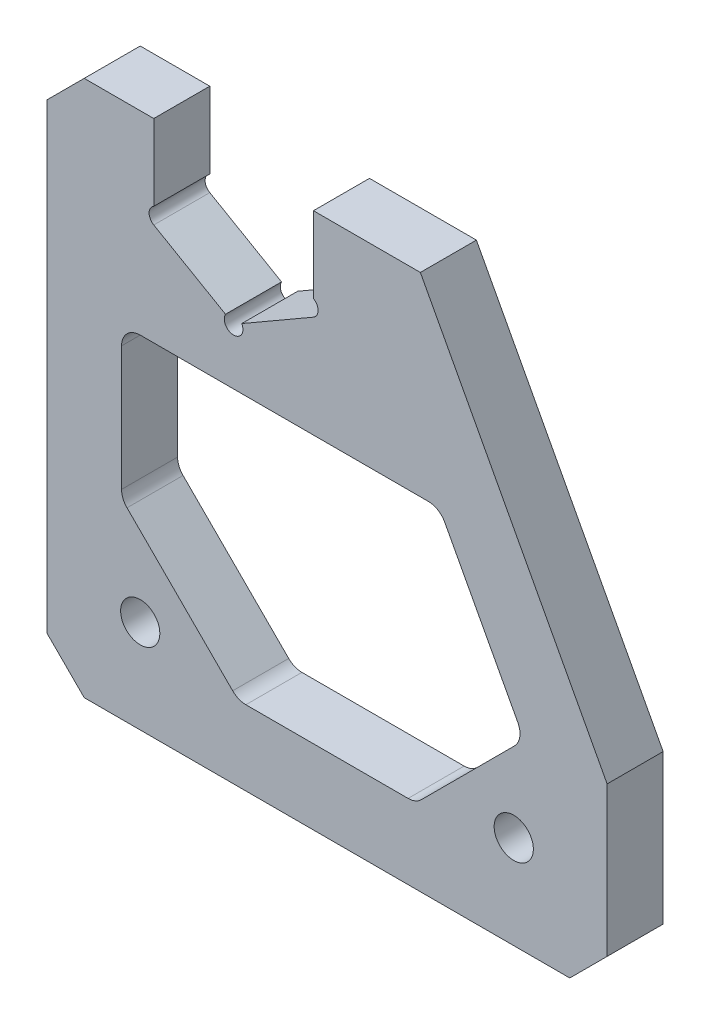
ISO-10303-21;
HEADER;
FILE_DESCRIPTION(('STEP AP214'),'2;1');
FILE_NAME('part.step','',(''),(''),'','','');
FILE_SCHEMA(('AUTOMOTIVE_DESIGN { 1 0 10303 214 1 1 1 1 }'));
ENDSEC;
DATA;
#1=APPLICATION_CONTEXT('core data for automotive mechanical design processes');
#2=APPLICATION_PROTOCOL_DEFINITION('international standard','automotive_design',2000,#1);
#3=PRODUCT_CONTEXT('',#1,'mechanical');
#4=PRODUCT('Part','Part','',(#3));
#5=PRODUCT_RELATED_PRODUCT_CATEGORY('part','',(#4));
#6=PRODUCT_DEFINITION_FORMATION('','',#4);
#7=PRODUCT_DEFINITION_CONTEXT('part definition',#1,'design');
#8=PRODUCT_DEFINITION('design','',#6,#7);
#9=PRODUCT_DEFINITION_SHAPE('','',#8);
#10=(LENGTH_UNIT() NAMED_UNIT(*) SI_UNIT(.MILLI.,.METRE.));
#11=(NAMED_UNIT(*) PLANE_ANGLE_UNIT() SI_UNIT($,.RADIAN.));
#12=(NAMED_UNIT(*) SI_UNIT($,.STERADIAN.) SOLID_ANGLE_UNIT());
#13=UNCERTAINTY_MEASURE_WITH_UNIT(LENGTH_MEASURE(1.E-05),#10,'distance_accuracy_value','');
#14=(GEOMETRIC_REPRESENTATION_CONTEXT(3) GLOBAL_UNCERTAINTY_ASSIGNED_CONTEXT((#13)) GLOBAL_UNIT_ASSIGNED_CONTEXT((#10,
#11,#12)) REPRESENTATION_CONTEXT('',''));
#15=CARTESIAN_POINT('',(0.,0.,0.));
#16=DIRECTION('',(0.,0.,1.));
#17=DIRECTION('',(1.,0.,0.));
#18=AXIS2_PLACEMENT_3D('',#15,#16,#17);
#19=CARTESIAN_POINT('',(0.,0.,3.));
#20=DIRECTION('',(0.,0.,1.));
#21=DIRECTION('',(1.,0.,0.));
#22=AXIS2_PLACEMENT_3D('',#19,#20,#21);
#23=PLANE('',#22);
#24=DIRECTION('',(-1.,0.,0.));
#25=VECTOR('',#24,1.);
#26=CARTESIAN_POINT('',(-12.,-15.8726896031426,3.));
#27=LINE('',#26,#25);
#28=CARTESIAN_POINT('',(20.8478991758066,-15.8726896031426,3.));
#29=VERTEX_POINT('',#28);
#30=CARTESIAN_POINT('',(-10.,-15.8726896031426,3.));
#31=VERTEX_POINT('',#30);
#32=EDGE_CURVE('E513',#29,#31,#27,.T.);
#33=ORIENTED_EDGE('',*,*,#32,.F.);
#34=CARTESIAN_POINT('',(20.8478991758066,-17.8726896031426,3.));
#35=DIRECTION('',(0.,0.,1.));
#36=DIRECTION('',(1.,0.,0.));
#37=AXIS2_PLACEMENT_3D('',#34,#35,#36);
#38=CIRCLE('',#37,2.);
#39=CARTESIAN_POINT('',(22.6119403690712,-16.930267898986,3.));
#40=VERTEX_POINT('',#39);
#41=EDGE_CURVE('E396',#29,#40,#38,.F.);
#42=ORIENTED_EDGE('',*,*,#41,.T.);
#43=DIRECTION('',(-0.471210852078323,0.882020596632313,0.));
#44=VECTOR('',#43,1.);
#45=CARTESIAN_POINT('',(22.0469395382214,-15.8726896031426,3.));
#46=LINE('',#45,#44);
#47=CARTESIAN_POINT('',(30.4347580639227,-31.5731529262005,3.));
#48=VERTEX_POINT('',#47);
#49=EDGE_CURVE('E497',#48,#40,#46,.T.);
#50=ORIENTED_EDGE('',*,*,#49,.F.);
#51=CARTESIAN_POINT('',(28.670716870658,-32.5155746303572,3.));
#52=DIRECTION('',(0.,0.,1.));
#53=DIRECTION('',(1.,0.,0.));
#54=AXIS2_PLACEMENT_3D('',#51,#52,#53);
#55=CIRCLE('',#54,2.);
#56=CARTESIAN_POINT('',(30.0849304330311,-33.9297881927302,3.));
#57=VERTEX_POINT('',#56);
#58=EDGE_CURVE('E380',#48,#57,#55,.F.);
#59=ORIENTED_EDGE('',*,*,#58,.T.);
#60=DIRECTION('',(0.707106781186547,0.707106781186547,0.));
#61=VECTOR('',#60,1.);
#62=CARTESIAN_POINT('',(31.1335517084595,-32.8811669173019,3.));
#63=LINE('',#62,#61);
#64=CARTESIAN_POINT('',(20.1005050633883,-43.9142135623731,3.));
#65=VERTEX_POINT('',#64);
#66=EDGE_CURVE('E501',#65,#57,#63,.T.);
#67=ORIENTED_EDGE('',*,*,#66,.F.);
#68=CARTESIAN_POINT('',(18.6862915010152,-42.5,3.));
#69=DIRECTION('',(0.,0.,1.));
#70=DIRECTION('',(1.,0.,0.));
#71=AXIS2_PLACEMENT_3D('',#68,#69,#70);
#72=CIRCLE('',#71,2.);
#73=CARTESIAN_POINT('',(18.6862915010152,-44.5,3.));
#74=VERTEX_POINT('',#73);
#75=EDGE_CURVE('E384',#65,#74,#72,.F.);
#76=ORIENTED_EDGE('',*,*,#75,.T.);
#77=DIRECTION('',(1.,0.,0.));
#78=VECTOR('',#77,1.);
#79=CARTESIAN_POINT('',(19.5147186257614,-44.5,3.));
#80=LINE('',#79,#78);
#81=CARTESIAN_POINT('',(1.31370849898476,-44.5,3.));
#82=VERTEX_POINT('',#81);
#83=EDGE_CURVE('E504',#82,#74,#80,.T.);
#84=ORIENTED_EDGE('',*,*,#83,.F.);
#85=CARTESIAN_POINT('',(1.31370849898476,-42.5,3.));
#86=DIRECTION('',(0.,0.,1.));
#87=DIRECTION('',(1.,0.,0.));
#88=AXIS2_PLACEMENT_3D('',#85,#86,#87);
#89=CIRCLE('',#88,2.);
#90=CARTESIAN_POINT('',(-0.100505063388337,-43.9142135623731,3.));
#91=VERTEX_POINT('',#90);
#92=EDGE_CURVE('E388',#82,#91,#89,.F.);
#93=ORIENTED_EDGE('',*,*,#92,.T.);
#94=DIRECTION('',(0.707106781186548,-0.707106781186547,0.));
#95=VECTOR('',#94,1.);
#96=CARTESIAN_POINT('',(0.485281374238568,-44.5,3.));
#97=LINE('',#96,#95);
#98=CARTESIAN_POINT('',(-11.4142135623731,-32.6005050633883,3.));
#99=VERTEX_POINT('',#98);
#100=EDGE_CURVE('E507',#99,#91,#97,.T.);
#101=ORIENTED_EDGE('',*,*,#100,.F.);
#102=CARTESIAN_POINT('',(-10.,-31.1862915010152,3.));
#103=DIRECTION('',(0.,0.,1.));
#104=DIRECTION('',(1.,0.,0.));
#105=AXIS2_PLACEMENT_3D('',#102,#103,#104);
#106=CIRCLE('',#105,2.);
#107=CARTESIAN_POINT('',(-12.,-31.1862915010152,3.));
#108=VERTEX_POINT('',#107);
#109=EDGE_CURVE('E392',#99,#108,#106,.F.);
#110=ORIENTED_EDGE('',*,*,#109,.T.);
#111=DIRECTION('',(0.,-1.,0.));
#112=VECTOR('',#111,1.);
#113=CARTESIAN_POINT('',(-12.,-15.8726896031426,3.));
#114=LINE('',#113,#112);
#115=CARTESIAN_POINT('',(-12.,-17.8726896031426,3.));
#116=VERTEX_POINT('',#115);
#117=EDGE_CURVE('E510',#116,#108,#114,.T.);
#118=ORIENTED_EDGE('',*,*,#117,.F.);
#119=CARTESIAN_POINT('',(-10.,-17.8726896031426,3.));
#120=DIRECTION('',(0.,0.,1.));
#121=DIRECTION('',(1.,0.,0.));
#122=AXIS2_PLACEMENT_3D('',#119,#120,#121);
#123=CIRCLE('',#122,2.);
#124=EDGE_CURVE('E399',#116,#31,#123,.F.);
#125=ORIENTED_EDGE('',*,*,#124,.T.);
#126=EDGE_LOOP('',(#33,#42,#50,#59,#67,#76,#84,#93,#101,#110,#118,#125));
#127=FACE_BOUND('',#126,.T.);
#128=CARTESIAN_POINT('',(-8.04999999999992,-4.07031939778692,3.));
#129=DIRECTION('',(0.,0.,1.));
#130=DIRECTION('',(1.,0.,0.));
#131=AXIS2_PLACEMENT_3D('',#128,#129,#130);
#132=CIRCLE('',#131,1.);
#133=CARTESIAN_POINT('',(-8.54999999999997,-3.2042939940025,3.));
#134=VERTEX_POINT('',#133);
#135=CARTESIAN_POINT('',(-8.54999999999995,-4.93634480157134,3.));
#136=VERTEX_POINT('',#135);
#137=EDGE_CURVE('E494',#134,#136,#132,.T.);
#138=ORIENTED_EDGE('',*,*,#137,.F.);
#139=DIRECTION('',(0.,1.,0.));
#140=VECTOR('',#139,1.);
#141=CARTESIAN_POINT('',(-8.55000000000005,4.93634480157122,3.));
#142=LINE('',#141,#140);
#143=CARTESIAN_POINT('',(-8.55000000000005,4.93634480157122,3.));
#144=VERTEX_POINT('',#143);
#145=EDGE_CURVE('E252',#134,#144,#142,.T.);
#146=ORIENTED_EDGE('',*,*,#145,.T.);
#147=DIRECTION('',(-1.,0.,0.));
#148=VECTOR('',#147,1.);
#149=CARTESIAN_POINT('',(-8.55000000000005,4.93634480157122,3.));
#150=LINE('',#149,#148);
#151=CARTESIAN_POINT('',(-16.,4.93634480157122,3.));
#152=VERTEX_POINT('',#151);
#153=EDGE_CURVE('E255',#144,#152,#150,.T.);
#154=ORIENTED_EDGE('',*,*,#153,.T.);
#155=DIRECTION('',(0.707106781186549,0.707106781186546,0.));
#156=VECTOR('',#155,1.);
#157=CARTESIAN_POINT('',(-10.4681724007856,10.4681724007856,3.));
#158=LINE('',#157,#156);
#159=CARTESIAN_POINT('',(-20.,0.936344801571235,3.));
#160=VERTEX_POINT('',#159);
#161=EDGE_CURVE('E333',#152,#160,#158,.F.);
#162=ORIENTED_EDGE('',*,*,#161,.T.);
#163=DIRECTION('',(0.,-1.,0.));
#164=VECTOR('',#163,1.);
#165=CARTESIAN_POINT('',(-20.,4.93634480157122,3.));
#166=LINE('',#165,#164);
#167=CARTESIAN_POINT('',(-20.,-48.5,3.));
#168=VERTEX_POINT('',#167);
#169=EDGE_CURVE('E266',#160,#168,#166,.T.);
#170=ORIENTED_EDGE('',*,*,#169,.T.);
#171=DIRECTION('',(-0.707106781186546,0.707106781186549,0.));
#172=VECTOR('',#171,1.);
#173=CARTESIAN_POINT('',(-34.25,-34.2499999999999,3.));
#174=LINE('',#173,#172);
#175=CARTESIAN_POINT('',(-16.,-52.5,3.));
#176=VERTEX_POINT('',#175);
#177=EDGE_CURVE('E335',#168,#176,#174,.F.);
#178=ORIENTED_EDGE('',*,*,#177,.T.);
#179=DIRECTION('',(1.,0.,0.));
#180=VECTOR('',#179,1.);
#181=CARTESIAN_POINT('',(-20.,-52.5,3.));
#182=LINE('',#181,#180);
#183=CARTESIAN_POINT('',(36.,-52.5,3.));
#184=VERTEX_POINT('',#183);
#185=EDGE_CURVE('E269',#176,#184,#182,.T.);
#186=ORIENTED_EDGE('',*,*,#185,.T.);
#187=DIRECTION('',(-0.70710678118655,-0.707106781186545,0.));
#188=VECTOR('',#187,1.);
#189=CARTESIAN_POINT('',(44.2499999999999,-44.2500000000002,3.));
#190=LINE('',#189,#188);
#191=CARTESIAN_POINT('',(40.,-48.5,3.));
#192=VERTEX_POINT('',#191);
#193=EDGE_CURVE('E337',#184,#192,#190,.F.);
#194=ORIENTED_EDGE('',*,*,#193,.T.);
#195=DIRECTION('',(0.,1.,0.));
#196=VECTOR('',#195,1.);
#197=CARTESIAN_POINT('',(40.,-32.5,3.));
#198=LINE('',#197,#196);
#199=CARTESIAN_POINT('',(40.,-32.5,3.));
#200=VERTEX_POINT('',#199);
#201=EDGE_CURVE('E272',#192,#200,#198,.T.);
#202=ORIENTED_EDGE('',*,*,#201,.T.);
#203=DIRECTION('',(-0.471210852078323,0.882020596632313,0.));
#204=VECTOR('',#203,1.);
#205=CARTESIAN_POINT('',(20.,4.93634480157133,3.));
#206=LINE('',#205,#204);
#207=CARTESIAN_POINT('',(20.,4.93634480157133,3.));
#208=VERTEX_POINT('',#207);
#209=EDGE_CURVE('E274',#200,#208,#206,.T.);
#210=ORIENTED_EDGE('',*,*,#209,.T.);
#211=DIRECTION('',(-1.,0.,0.));
#212=VECTOR('',#211,1.);
#213=CARTESIAN_POINT('',(8.54999999999998,4.93634480157134,3.));
#214=LINE('',#213,#212);
#215=CARTESIAN_POINT('',(8.54999999999998,4.93634480157134,3.));
#216=VERTEX_POINT('',#215);
#217=EDGE_CURVE('E276',#208,#216,#214,.T.);
#218=ORIENTED_EDGE('',*,*,#217,.T.);
#219=DIRECTION('',(0.,-1.,0.));
#220=VECTOR('',#219,1.);
#221=CARTESIAN_POINT('',(8.55000000000002,-4.93634480157128,3.));
#222=LINE('',#221,#220);
#223=CARTESIAN_POINT('',(8.55000000000001,-3.2042939940024,3.));
#224=VERTEX_POINT('',#223);
#225=EDGE_CURVE('E278',#216,#224,#222,.T.);
#226=ORIENTED_EDGE('',*,*,#225,.T.);
#227=CARTESIAN_POINT('',(8.05000000000002,-4.07031939778685,3.));
#228=DIRECTION('',(0.,0.,1.));
#229=DIRECTION('',(1.,0.,0.));
#230=AXIS2_PLACEMENT_3D('',#227,#228,#229);
#231=CIRCLE('',#230,1.);
#232=CARTESIAN_POINT('',(8.55000000000002,-4.93634480157128,3.));
#233=VERTEX_POINT('',#232);
#234=EDGE_CURVE('E480',#233,#224,#231,.T.);
#235=ORIENTED_EDGE('',*,*,#234,.F.);
#236=DIRECTION('',(-0.866025403784438,-0.500000000000001,0.));
#237=VECTOR('',#236,1.);
#238=CARTESIAN_POINT('',(0.,-9.87268960314261,3.));
#239=LINE('',#238,#237);
#240=CARTESIAN_POINT('',(0.866025403784438,-9.37268960314261,3.));
#241=VERTEX_POINT('',#240);
#242=EDGE_CURVE('E247',#233,#241,#239,.T.);
#243=ORIENTED_EDGE('',*,*,#242,.T.);
#244=CARTESIAN_POINT('',(0.,-9.87268960314261,3.));
#245=DIRECTION('',(0.,0.,1.));
#246=DIRECTION('',(1.,0.,0.));
#247=AXIS2_PLACEMENT_3D('',#244,#245,#246);
#248=CIRCLE('',#247,1.);
#249=CARTESIAN_POINT('',(-0.866025403784443,-9.37268960314261,3.));
#250=VERTEX_POINT('',#249);
#251=EDGE_CURVE('E227',#250,#241,#248,.T.);
#252=ORIENTED_EDGE('',*,*,#251,.F.);
#253=DIRECTION('',(-0.866025403784441,0.499999999999995,0.));
#254=VECTOR('',#253,1.);
#255=CARTESIAN_POINT('',(-8.54999999999995,-4.9363448015714,3.));
#256=LINE('',#255,#254);
#257=EDGE_CURVE('E243',#250,#136,#256,.T.);
#258=ORIENTED_EDGE('',*,*,#257,.T.);
#259=EDGE_LOOP('',(#138,#146,#154,#162,#170,#178,#186,#194,#202,#210,#218,#226,#235,#243,#252,#258));
#260=FACE_BOUND('',#259,.T.);
#261=CARTESIAN_POINT('',(-9.99999999999999,-42.5,3.));
#262=DIRECTION('',(0.,0.,1.));
#263=DIRECTION('',(1.,0.,0.));
#264=AXIS2_PLACEMENT_3D('',#261,#262,#263);
#265=CIRCLE('',#264,2.1);
#266=CARTESIAN_POINT('',(-7.9,-42.5,3.));
#267=VERTEX_POINT('',#266);
#268=EDGE_CURVE('E261',#267,#267,#265,.T.);
#269=ORIENTED_EDGE('',*,*,#268,.F.);
#270=EDGE_LOOP('',(#269));
#271=FACE_BOUND('',#270,.T.);
#272=CARTESIAN_POINT('',(30.,-42.5,3.));
#273=DIRECTION('',(0.,0.,1.));
#274=DIRECTION('',(1.,0.,0.));
#275=AXIS2_PLACEMENT_3D('',#272,#273,#274);
#276=CIRCLE('',#275,2.1);
#277=CARTESIAN_POINT('',(32.1,-42.5,3.));
#278=VERTEX_POINT('',#277);
#279=EDGE_CURVE('E486',#278,#278,#276,.T.);
#280=ORIENTED_EDGE('',*,*,#279,.F.);
#281=EDGE_LOOP('',(#280));
#282=FACE_BOUND('',#281,.T.);
#283=ADVANCED_FACE('F37',(#127,#260,#271,#282),#23,.T.);
#284=CARTESIAN_POINT('',(0.,0.,-3.));
#285=DIRECTION('',(0.,0.,1.));
#286=DIRECTION('',(1.,0.,0.));
#287=AXIS2_PLACEMENT_3D('',#284,#285,#286);
#288=PLANE('',#287);
#289=CARTESIAN_POINT('',(-9.99999999999999,-42.5,-3.));
#290=DIRECTION('',(0.,0.,1.));
#291=DIRECTION('',(1.,0.,0.));
#292=AXIS2_PLACEMENT_3D('',#289,#290,#291);
#293=CIRCLE('',#292,4.09999999999999);
#294=CARTESIAN_POINT('',(-5.90000000000001,-42.5,-3.));
#295=VERTEX_POINT('',#294);
#296=EDGE_CURVE('E406',#295,#295,#293,.T.);
#297=ORIENTED_EDGE('',*,*,#296,.T.);
#298=EDGE_LOOP('',(#297));
#299=FACE_BOUND('',#298,.T.);
#300=CARTESIAN_POINT('',(30.,-42.5,-3.));
#301=DIRECTION('',(0.,0.,1.));
#302=DIRECTION('',(1.,0.,0.));
#303=AXIS2_PLACEMENT_3D('',#300,#301,#302);
#304=CIRCLE('',#303,4.09999999999999);
#305=CARTESIAN_POINT('',(34.1,-42.5,-3.));
#306=VERTEX_POINT('',#305);
#307=EDGE_CURVE('E403',#306,#306,#304,.T.);
#308=ORIENTED_EDGE('',*,*,#307,.T.);
#309=EDGE_LOOP('',(#308));
#310=FACE_BOUND('',#309,.T.);
#311=DIRECTION('',(0.707106781186547,0.707106781186547,0.));
#312=VECTOR('',#311,1.);
#313=CARTESIAN_POINT('',(31.1335517084595,-32.8811669173019,-3.));
#314=LINE('',#313,#312);
#315=CARTESIAN_POINT('',(20.1005050633883,-43.9142135623731,-3.));
#316=VERTEX_POINT('',#315);
#317=CARTESIAN_POINT('',(30.0849304330311,-33.9297881927302,-3.));
#318=VERTEX_POINT('',#317);
#319=EDGE_CURVE('E428',#316,#318,#314,.T.);
#320=ORIENTED_EDGE('',*,*,#319,.T.);
#321=CARTESIAN_POINT('',(28.670716870658,-32.5155746303572,-3.));
#322=DIRECTION('',(0.,0.,1.));
#323=DIRECTION('',(1.,0.,0.));
#324=AXIS2_PLACEMENT_3D('',#321,#322,#323);
#325=CIRCLE('',#324,2.);
#326=CARTESIAN_POINT('',(30.4347580639227,-31.5731529262005,-3.));
#327=VERTEX_POINT('',#326);
#328=EDGE_CURVE('E382',#318,#327,#325,.T.);
#329=ORIENTED_EDGE('',*,*,#328,.T.);
#330=DIRECTION('',(-0.471210852078323,0.882020596632313,0.));
#331=VECTOR('',#330,1.);
#332=CARTESIAN_POINT('',(22.0469395382214,-15.8726896031426,-3.));
#333=LINE('',#332,#331);
#334=CARTESIAN_POINT('',(22.6119403690712,-16.930267898986,-3.));
#335=VERTEX_POINT('',#334);
#336=EDGE_CURVE('E248',#327,#335,#333,.T.);
#337=ORIENTED_EDGE('',*,*,#336,.T.);
#338=CARTESIAN_POINT('',(20.8478991758066,-17.8726896031426,-3.));
#339=DIRECTION('',(0.,0.,1.));
#340=DIRECTION('',(1.,0.,0.));
#341=AXIS2_PLACEMENT_3D('',#338,#339,#340);
#342=CIRCLE('',#341,2.);
#343=CARTESIAN_POINT('',(20.8478991758066,-15.8726896031426,-3.));
#344=VERTEX_POINT('',#343);
#345=EDGE_CURVE('E60',#335,#344,#342,.T.);
#346=ORIENTED_EDGE('',*,*,#345,.T.);
#347=DIRECTION('',(-1.,0.,0.));
#348=VECTOR('',#347,1.);
#349=CARTESIAN_POINT('',(-12.,-15.8726896031426,-3.));
#350=LINE('',#349,#348);
#351=CARTESIAN_POINT('',(-10.,-15.8726896031426,-3.));
#352=VERTEX_POINT('',#351);
#353=EDGE_CURVE('E500',#344,#352,#350,.T.);
#354=ORIENTED_EDGE('',*,*,#353,.T.);
#355=CARTESIAN_POINT('',(-10.,-17.8726896031426,-3.));
#356=DIRECTION('',(0.,0.,1.));
#357=DIRECTION('',(1.,0.,0.));
#358=AXIS2_PLACEMENT_3D('',#355,#356,#357);
#359=CIRCLE('',#358,2.);
#360=CARTESIAN_POINT('',(-12.,-17.8726896031426,-3.));
#361=VERTEX_POINT('',#360);
#362=EDGE_CURVE('E401',#352,#361,#359,.T.);
#363=ORIENTED_EDGE('',*,*,#362,.T.);
#364=DIRECTION('',(0.,-1.,0.));
#365=VECTOR('',#364,1.);
#366=CARTESIAN_POINT('',(-12.,-15.8726896031426,-3.));
#367=LINE('',#366,#365);
#368=CARTESIAN_POINT('',(-12.,-31.1862915010152,-3.));
#369=VERTEX_POINT('',#368);
#370=EDGE_CURVE('E523',#361,#369,#367,.T.);
#371=ORIENTED_EDGE('',*,*,#370,.T.);
#372=CARTESIAN_POINT('',(-10.,-31.1862915010152,-3.));
#373=DIRECTION('',(0.,0.,1.));
#374=DIRECTION('',(1.,0.,0.));
#375=AXIS2_PLACEMENT_3D('',#372,#373,#374);
#376=CIRCLE('',#375,2.);
#377=CARTESIAN_POINT('',(-11.4142135623731,-32.6005050633883,-3.));
#378=VERTEX_POINT('',#377);
#379=EDGE_CURVE('E394',#369,#378,#376,.T.);
#380=ORIENTED_EDGE('',*,*,#379,.T.);
#381=DIRECTION('',(0.707106781186548,-0.707106781186547,0.));
#382=VECTOR('',#381,1.);
#383=CARTESIAN_POINT('',(0.485281374238568,-44.5,-3.));
#384=LINE('',#383,#382);
#385=CARTESIAN_POINT('',(-0.100505063388337,-43.9142135623731,-3.));
#386=VERTEX_POINT('',#385);
#387=EDGE_CURVE('E520',#378,#386,#384,.T.);
#388=ORIENTED_EDGE('',*,*,#387,.T.);
#389=CARTESIAN_POINT('',(1.31370849898476,-42.5,-3.));
#390=DIRECTION('',(0.,0.,1.));
#391=DIRECTION('',(1.,0.,0.));
#392=AXIS2_PLACEMENT_3D('',#389,#390,#391);
#393=CIRCLE('',#392,2.);
#394=CARTESIAN_POINT('',(1.31370849898476,-44.5,-3.));
#395=VERTEX_POINT('',#394);
#396=EDGE_CURVE('E390',#386,#395,#393,.T.);
#397=ORIENTED_EDGE('',*,*,#396,.T.);
#398=DIRECTION('',(1.,0.,0.));
#399=VECTOR('',#398,1.);
#400=CARTESIAN_POINT('',(19.5147186257614,-44.5,-3.));
#401=LINE('',#400,#399);
#402=CARTESIAN_POINT('',(18.6862915010152,-44.5,-3.));
#403=VERTEX_POINT('',#402);
#404=EDGE_CURVE('E517',#395,#403,#401,.T.);
#405=ORIENTED_EDGE('',*,*,#404,.T.);
#406=CARTESIAN_POINT('',(18.6862915010152,-42.5,-3.));
#407=DIRECTION('',(0.,0.,1.));
#408=DIRECTION('',(1.,0.,0.));
#409=AXIS2_PLACEMENT_3D('',#406,#407,#408);
#410=CIRCLE('',#409,2.);
#411=EDGE_CURVE('E386',#403,#316,#410,.T.);
#412=ORIENTED_EDGE('',*,*,#411,.T.);
#413=EDGE_LOOP('',(#320,#329,#337,#346,#354,#363,#371,#380,#388,#397,#405,#412));
#414=FACE_BOUND('',#413,.T.);
#415=DIRECTION('',(0.,1.,0.));
#416=VECTOR('',#415,1.);
#417=CARTESIAN_POINT('',(-8.55000000000005,4.93634480157122,-3.));
#418=LINE('',#417,#416);
#419=CARTESIAN_POINT('',(-8.54999999999997,-3.2042939940025,-3.));
#420=VERTEX_POINT('',#419);
#421=CARTESIAN_POINT('',(-8.55000000000005,4.93634480157122,-3.));
#422=VERTEX_POINT('',#421);
#423=EDGE_CURVE('E285',#420,#422,#418,.T.);
#424=ORIENTED_EDGE('',*,*,#423,.F.);
#425=CARTESIAN_POINT('',(-8.04999999999992,-4.07031939778692,-3.));
#426=DIRECTION('',(0.,0.,1.));
#427=DIRECTION('',(1.,0.,0.));
#428=AXIS2_PLACEMENT_3D('',#425,#426,#427);
#429=CIRCLE('',#428,1.);
#430=CARTESIAN_POINT('',(-8.54999999999995,-4.93634480157134,-3.));
#431=VERTEX_POINT('',#430);
#432=EDGE_CURVE('E236',#420,#431,#429,.T.);
#433=ORIENTED_EDGE('',*,*,#432,.T.);
#434=DIRECTION('',(-0.866025403784441,0.499999999999995,0.));
#435=VECTOR('',#434,1.);
#436=CARTESIAN_POINT('',(-8.54999999999995,-4.9363448015714,-3.));
#437=LINE('',#436,#435);
#438=CARTESIAN_POINT('',(-0.866025403784443,-9.37268960314261,-3.));
#439=VERTEX_POINT('',#438);
#440=EDGE_CURVE('E283',#439,#431,#437,.T.);
#441=ORIENTED_EDGE('',*,*,#440,.F.);
#442=CARTESIAN_POINT('',(0.,-9.87268960314261,-3.));
#443=DIRECTION('',(0.,0.,1.));
#444=DIRECTION('',(1.,0.,0.));
#445=AXIS2_PLACEMENT_3D('',#442,#443,#444);
#446=CIRCLE('',#445,1.);
#447=CARTESIAN_POINT('',(0.866025403784439,-9.37268960314261,-3.));
#448=VERTEX_POINT('',#447);
#449=EDGE_CURVE('E230',#439,#448,#446,.T.);
#450=ORIENTED_EDGE('',*,*,#449,.T.);
#451=DIRECTION('',(-0.866025403784438,-0.500000000000001,0.));
#452=VECTOR('',#451,1.);
#453=CARTESIAN_POINT('',(0.,-9.87268960314261,-3.));
#454=LINE('',#453,#452);
#455=CARTESIAN_POINT('',(8.55000000000002,-4.93634480157128,-3.));
#456=VERTEX_POINT('',#455);
#457=EDGE_CURVE('E253',#456,#448,#454,.T.);
#458=ORIENTED_EDGE('',*,*,#457,.F.);
#459=CARTESIAN_POINT('',(8.05000000000002,-4.07031939778685,-3.));
#460=DIRECTION('',(0.,0.,1.));
#461=DIRECTION('',(1.,0.,0.));
#462=AXIS2_PLACEMENT_3D('',#459,#460,#461);
#463=CIRCLE('',#462,1.);
#464=CARTESIAN_POINT('',(8.55000000000001,-3.2042939940024,-3.));
#465=VERTEX_POINT('',#464);
#466=EDGE_CURVE('E492',#456,#465,#463,.T.);
#467=ORIENTED_EDGE('',*,*,#466,.T.);
#468=DIRECTION('',(0.,-1.,0.));
#469=VECTOR('',#468,1.);
#470=CARTESIAN_POINT('',(8.55000000000002,-4.93634480157128,-3.));
#471=LINE('',#470,#469);
#472=CARTESIAN_POINT('',(8.54999999999998,4.93634480157134,-3.));
#473=VERTEX_POINT('',#472);
#474=EDGE_CURVE('E258',#473,#465,#471,.T.);
#475=ORIENTED_EDGE('',*,*,#474,.F.);
#476=DIRECTION('',(-1.,0.,0.));
#477=VECTOR('',#476,1.);
#478=CARTESIAN_POINT('',(8.54999999999998,4.93634480157134,-3.));
#479=LINE('',#478,#477);
#480=CARTESIAN_POINT('',(20.,4.93634480157133,-3.));
#481=VERTEX_POINT('',#480);
#482=EDGE_CURVE('E300',#481,#473,#479,.T.);
#483=ORIENTED_EDGE('',*,*,#482,.F.);
#484=DIRECTION('',(-0.471210852078323,0.882020596632313,0.));
#485=VECTOR('',#484,1.);
#486=CARTESIAN_POINT('',(20.,4.93634480157133,-3.));
#487=LINE('',#486,#485);
#488=CARTESIAN_POINT('',(40.,-32.5,-3.));
#489=VERTEX_POINT('',#488);
#490=EDGE_CURVE('E298',#489,#481,#487,.T.);
#491=ORIENTED_EDGE('',*,*,#490,.F.);
#492=DIRECTION('',(0.,1.,0.));
#493=VECTOR('',#492,1.);
#494=CARTESIAN_POINT('',(40.,-32.5,-3.));
#495=LINE('',#494,#493);
#496=CARTESIAN_POINT('',(40.,-48.5,-3.));
#497=VERTEX_POINT('',#496);
#498=EDGE_CURVE('E296',#497,#489,#495,.T.);
#499=ORIENTED_EDGE('',*,*,#498,.F.);
#500=DIRECTION('',(0.70710678118655,0.707106781186545,0.));
#501=VECTOR('',#500,1.);
#502=CARTESIAN_POINT('',(40.,-48.5,-3.));
#503=LINE('',#502,#501);
#504=CARTESIAN_POINT('',(36.,-52.5,-3.));
#505=VERTEX_POINT('',#504);
#506=EDGE_CURVE('E326',#497,#505,#503,.F.);
#507=ORIENTED_EDGE('',*,*,#506,.T.);
#508=DIRECTION('',(1.,0.,0.));
#509=VECTOR('',#508,1.);
#510=CARTESIAN_POINT('',(-20.,-52.5,-3.));
#511=LINE('',#510,#509);
#512=CARTESIAN_POINT('',(-16.,-52.5,-3.));
#513=VERTEX_POINT('',#512);
#514=EDGE_CURVE('E293',#513,#505,#511,.T.);
#515=ORIENTED_EDGE('',*,*,#514,.F.);
#516=DIRECTION('',(0.707106781186546,-0.707106781186549,0.));
#517=VECTOR('',#516,1.);
#518=CARTESIAN_POINT('',(-16.,-52.5,-3.));
#519=LINE('',#518,#517);
#520=CARTESIAN_POINT('',(-20.,-48.5,-3.));
#521=VERTEX_POINT('',#520);
#522=EDGE_CURVE('E324',#513,#521,#519,.F.);
#523=ORIENTED_EDGE('',*,*,#522,.T.);
#524=DIRECTION('',(0.,-1.,0.));
#525=VECTOR('',#524,1.);
#526=CARTESIAN_POINT('',(-20.,4.93634480157122,-3.));
#527=LINE('',#526,#525);
#528=CARTESIAN_POINT('',(-20.,0.936344801571235,-3.));
#529=VERTEX_POINT('',#528);
#530=EDGE_CURVE('E290',#529,#521,#527,.T.);
#531=ORIENTED_EDGE('',*,*,#530,.F.);
#532=DIRECTION('',(-0.707106781186549,-0.707106781186546,0.));
#533=VECTOR('',#532,1.);
#534=CARTESIAN_POINT('',(-20.,0.936344801571235,-3.));
#535=LINE('',#534,#533);
#536=CARTESIAN_POINT('',(-16.,4.93634480157122,-3.));
#537=VERTEX_POINT('',#536);
#538=EDGE_CURVE('E322',#529,#537,#535,.F.);
#539=ORIENTED_EDGE('',*,*,#538,.T.);
#540=DIRECTION('',(-1.,0.,0.));
#541=VECTOR('',#540,1.);
#542=CARTESIAN_POINT('',(-8.55000000000005,4.93634480157122,-3.));
#543=LINE('',#542,#541);
#544=EDGE_CURVE('E287',#422,#537,#543,.T.);
#545=ORIENTED_EDGE('',*,*,#544,.F.);
#546=EDGE_LOOP('',(#424,#433,#441,#450,#458,#467,#475,#483,#491,#499,#507,#515,#523,#531,#539,#545));
#547=FACE_BOUND('',#546,.T.);
#548=ADVANCED_FACE('F420',(#299,#310,#414,#547),#288,.F.);
#549=CARTESIAN_POINT('',(-8.54999999999995,-4.9363448015714,3.));
#550=DIRECTION('',(-0.499999999999995,-0.866025403784442,0.));
#551=DIRECTION('',(0.866025403784442,-0.499999999999995,0.));
#552=AXIS2_PLACEMENT_3D('',#549,#550,#551);
#553=PLANE('',#552);
#554=ORIENTED_EDGE('',*,*,#257,.F.);
#555=DIRECTION('',(0.,0.,1.));
#556=VECTOR('',#555,1.);
#557=CARTESIAN_POINT('',(-0.866025403784443,-9.37268960314261,-3.));
#558=LINE('',#557,#556);
#559=EDGE_CURVE('E224',#250,#439,#558,.F.);
#560=ORIENTED_EDGE('',*,*,#559,.T.);
#561=ORIENTED_EDGE('',*,*,#440,.T.);
#562=DIRECTION('',(0.,0.,-1.));
#563=VECTOR('',#562,1.);
#564=CARTESIAN_POINT('',(-8.54999999999995,-4.9363448015714,3.));
#565=LINE('',#564,#563);
#566=EDGE_CURVE('E251',#136,#431,#565,.T.);
#567=ORIENTED_EDGE('',*,*,#566,.F.);
#568=EDGE_LOOP('',(#554,#560,#561,#567));
#569=FACE_BOUND('',#568,.T.);
#570=ADVANCED_FACE('F250',(#569),#553,.F.);
#571=CARTESIAN_POINT('',(-8.55000000000005,4.93634480157122,3.));
#572=DIRECTION('',(-1.,0.,0.));
#573=DIRECTION('',(0.,-1.,0.));
#574=AXIS2_PLACEMENT_3D('',#571,#572,#573);
#575=PLANE('',#574);
#576=ORIENTED_EDGE('',*,*,#145,.F.);
#577=DIRECTION('',(0.,0.,1.));
#578=VECTOR('',#577,1.);
#579=CARTESIAN_POINT('',(-8.54999999999997,-3.2042939940025,-3.));
#580=LINE('',#579,#578);
#581=EDGE_CURVE('E348',#134,#420,#580,.F.);
#582=ORIENTED_EDGE('',*,*,#581,.T.);
#583=ORIENTED_EDGE('',*,*,#423,.T.);
#584=DIRECTION('',(0.,0.,-1.));
#585=VECTOR('',#584,1.);
#586=CARTESIAN_POINT('',(-8.55000000000005,4.93634480157122,3.));
#587=LINE('',#586,#585);
#588=EDGE_CURVE('E315',#144,#422,#587,.T.);
#589=ORIENTED_EDGE('',*,*,#588,.F.);
#590=EDGE_LOOP('',(#576,#582,#583,#589));
#591=FACE_BOUND('',#590,.T.);
#592=ADVANCED_FACE('F436',(#591),#575,.F.);
#593=CARTESIAN_POINT('',(-8.55000000000005,4.93634480157122,3.));
#594=DIRECTION('',(0.,-1.,0.));
#595=DIRECTION('',(0.,0.,-1.));
#596=AXIS2_PLACEMENT_3D('',#593,#594,#595);
#597=PLANE('',#596);
#598=ORIENTED_EDGE('',*,*,#544,.T.);
#599=DIRECTION('',(0.,0.,1.));
#600=VECTOR('',#599,1.);
#601=CARTESIAN_POINT('',(-16.,4.93634480157122,3.));
#602=LINE('',#601,#600);
#603=EDGE_CURVE('E344',#537,#152,#602,.T.);
#604=ORIENTED_EDGE('',*,*,#603,.T.);
#605=ORIENTED_EDGE('',*,*,#153,.F.);
#606=ORIENTED_EDGE('',*,*,#588,.T.);
#607=EDGE_LOOP('',(#598,#604,#605,#606));
#608=FACE_BOUND('',#607,.T.);
#609=ADVANCED_FACE('F439',(#608),#597,.F.);
#610=CARTESIAN_POINT('',(-20.,4.93634480157122,3.));
#611=DIRECTION('',(1.,0.,0.));
#612=DIRECTION('',(0.,1.,0.));
#613=AXIS2_PLACEMENT_3D('',#610,#611,#612);
#614=PLANE('',#613);
#615=ORIENTED_EDGE('',*,*,#530,.T.);
#616=DIRECTION('',(0.,0.,1.));
#617=VECTOR('',#616,1.);
#618=CARTESIAN_POINT('',(-20.,-48.5,3.));
#619=LINE('',#618,#617);
#620=EDGE_CURVE('E342',#521,#168,#619,.T.);
#621=ORIENTED_EDGE('',*,*,#620,.T.);
#622=ORIENTED_EDGE('',*,*,#169,.F.);
#623=DIRECTION('',(0.,0.,-1.));
#624=VECTOR('',#623,1.);
#625=CARTESIAN_POINT('',(-20.,0.936344801571235,3.));
#626=LINE('',#625,#624);
#627=EDGE_CURVE('E339',#160,#529,#626,.T.);
#628=ORIENTED_EDGE('',*,*,#627,.T.);
#629=EDGE_LOOP('',(#615,#621,#622,#628));
#630=FACE_BOUND('',#629,.T.);
#631=ADVANCED_FACE('F448',(#630),#614,.F.);
#632=CARTESIAN_POINT('',(-20.,-52.5,3.));
#633=DIRECTION('',(0.,1.,0.));
#634=DIRECTION('',(0.,0.,1.));
#635=AXIS2_PLACEMENT_3D('',#632,#633,#634);
#636=PLANE('',#635);
#637=ORIENTED_EDGE('',*,*,#514,.T.);
#638=DIRECTION('',(0.,0.,1.));
#639=VECTOR('',#638,1.);
#640=CARTESIAN_POINT('',(36.,-52.5,3.));
#641=LINE('',#640,#639);
#642=EDGE_CURVE('E331',#505,#184,#641,.T.);
#643=ORIENTED_EDGE('',*,*,#642,.T.);
#644=ORIENTED_EDGE('',*,*,#185,.F.);
#645=DIRECTION('',(0.,0.,-1.));
#646=VECTOR('',#645,1.);
#647=CARTESIAN_POINT('',(-16.,-52.5,3.));
#648=LINE('',#647,#646);
#649=EDGE_CURVE('E328',#176,#513,#648,.T.);
#650=ORIENTED_EDGE('',*,*,#649,.T.);
#651=EDGE_LOOP('',(#637,#643,#644,#650));
#652=FACE_BOUND('',#651,.T.);
#653=ADVANCED_FACE('F457',(#652),#636,.F.);
#654=CARTESIAN_POINT('',(40.,-32.5,3.));
#655=DIRECTION('',(-1.,0.,0.));
#656=DIRECTION('',(0.,-1.,0.));
#657=AXIS2_PLACEMENT_3D('',#654,#655,#656);
#658=PLANE('',#657);
#659=ORIENTED_EDGE('',*,*,#201,.F.);
#660=DIRECTION('',(0.,0.,-1.));
#661=VECTOR('',#660,1.);
#662=CARTESIAN_POINT('',(40.,-48.5,3.));
#663=LINE('',#662,#661);
#664=EDGE_CURVE('E319',#192,#497,#663,.T.);
#665=ORIENTED_EDGE('',*,*,#664,.T.);
#666=ORIENTED_EDGE('',*,*,#498,.T.);
#667=DIRECTION('',(0.,0.,-1.));
#668=VECTOR('',#667,1.);
#669=CARTESIAN_POINT('',(40.,-32.5,3.));
#670=LINE('',#669,#668);
#671=EDGE_CURVE('E312',#200,#489,#670,.T.);
#672=ORIENTED_EDGE('',*,*,#671,.F.);
#673=EDGE_LOOP('',(#659,#665,#666,#672));
#674=FACE_BOUND('',#673,.T.);
#675=ADVANCED_FACE('F466',(#674),#658,.F.);
#676=CARTESIAN_POINT('',(20.,4.93634480157133,3.));
#677=DIRECTION('',(-0.882020596632313,-0.471210852078322,0.));
#678=DIRECTION('',(0.471210852078323,-0.882020596632313,0.));
#679=AXIS2_PLACEMENT_3D('',#676,#677,#678);
#680=PLANE('',#679);
#681=ORIENTED_EDGE('',*,*,#490,.T.);
#682=DIRECTION('',(0.,0.,-1.));
#683=VECTOR('',#682,1.);
#684=CARTESIAN_POINT('',(20.,4.93634480157133,3.));
#685=LINE('',#684,#683);
#686=EDGE_CURVE('E309',#208,#481,#685,.T.);
#687=ORIENTED_EDGE('',*,*,#686,.F.);
#688=ORIENTED_EDGE('',*,*,#209,.F.);
#689=ORIENTED_EDGE('',*,*,#671,.T.);
#690=EDGE_LOOP('',(#681,#687,#688,#689));
#691=FACE_BOUND('',#690,.T.);
#692=ADVANCED_FACE('F473',(#691),#680,.F.);
#693=CARTESIAN_POINT('',(8.54999999999998,4.93634480157134,3.));
#694=DIRECTION('',(0.,-1.,0.));
#695=DIRECTION('',(1.,0.,0.));
#696=AXIS2_PLACEMENT_3D('',#693,#694,#695);
#697=PLANE('',#696);
#698=ORIENTED_EDGE('',*,*,#482,.T.);
#699=DIRECTION('',(0.,0.,-1.));
#700=VECTOR('',#699,1.);
#701=CARTESIAN_POINT('',(8.54999999999998,4.93634480157134,3.));
#702=LINE('',#701,#700);
#703=EDGE_CURVE('E306',#216,#473,#702,.T.);
#704=ORIENTED_EDGE('',*,*,#703,.F.);
#705=ORIENTED_EDGE('',*,*,#217,.F.);
#706=ORIENTED_EDGE('',*,*,#686,.T.);
#707=EDGE_LOOP('',(#698,#704,#705,#706));
#708=FACE_BOUND('',#707,.T.);
#709=ADVANCED_FACE('F477',(#708),#697,.F.);
#710=CARTESIAN_POINT('',(8.55000000000002,-4.93634480157128,3.));
#711=DIRECTION('',(1.,0.,0.));
#712=DIRECTION('',(0.,1.,0.));
#713=AXIS2_PLACEMENT_3D('',#710,#711,#712);
#714=PLANE('',#713);
#715=ORIENTED_EDGE('',*,*,#474,.T.);
#716=DIRECTION('',(0.,0.,1.));
#717=VECTOR('',#716,1.);
#718=CARTESIAN_POINT('',(8.55000000000001,-3.2042939940024,-3.));
#719=LINE('',#718,#717);
#720=EDGE_CURVE('E235',#465,#224,#719,.T.);
#721=ORIENTED_EDGE('',*,*,#720,.T.);
#722=ORIENTED_EDGE('',*,*,#225,.F.);
#723=ORIENTED_EDGE('',*,*,#703,.T.);
#724=EDGE_LOOP('',(#715,#721,#722,#723));
#725=FACE_BOUND('',#724,.T.);
#726=ADVANCED_FACE('F483',(#725),#714,.F.);
#727=CARTESIAN_POINT('',(0.,-9.87268960314261,3.));
#728=DIRECTION('',(0.500000000000001,-0.866025403784438,0.));
#729=DIRECTION('',(0.866025403784438,0.500000000000001,0.));
#730=AXIS2_PLACEMENT_3D('',#727,#728,#729);
#731=PLANE('',#730);
#732=ORIENTED_EDGE('',*,*,#457,.T.);
#733=DIRECTION('',(0.,0.,1.));
#734=VECTOR('',#733,1.);
#735=CARTESIAN_POINT('',(0.866025403784439,-9.37268960314261,-3.));
#736=LINE('',#735,#734);
#737=EDGE_CURVE('E346',#448,#241,#736,.T.);
#738=ORIENTED_EDGE('',*,*,#737,.T.);
#739=ORIENTED_EDGE('',*,*,#242,.F.);
#740=DIRECTION('',(0.,0.,-1.));
#741=VECTOR('',#740,1.);
#742=CARTESIAN_POINT('',(8.55000000000002,-4.93634480157128,3.));
#743=LINE('',#742,#741);
#744=EDGE_CURVE('E282',#233,#456,#743,.T.);
#745=ORIENTED_EDGE('',*,*,#744,.T.);
#746=EDGE_LOOP('',(#732,#738,#739,#745));
#747=FACE_BOUND('',#746,.T.);
#748=ADVANCED_FACE('F593',(#747),#731,.F.);
#749=CARTESIAN_POINT('',(-9.99999999999999,-42.5,3.));
#750=DIRECTION('',(0.,0.,-1.));
#751=DIRECTION('',(-1.,0.,0.));
#752=AXIS2_PLACEMENT_3D('',#749,#750,#751);
#753=CYLINDRICAL_SURFACE('',#752,2.1);
#754=CARTESIAN_POINT('',(-9.99999999999999,-42.5,-0.999999999999997));
#755=DIRECTION('',(0.,0.,1.));
#756=DIRECTION('',(1.,0.,0.));
#757=AXIS2_PLACEMENT_3D('',#754,#755,#756);
#758=CIRCLE('',#757,2.1);
#759=CARTESIAN_POINT('',(-7.9,-42.5,-0.999999999999997));
#760=VERTEX_POINT('',#759);
#761=EDGE_CURVE('E46',#760,#760,#758,.F.);
#762=ORIENTED_EDGE('',*,*,#761,.T.);
#763=EDGE_LOOP('',(#762));
#764=FACE_BOUND('',#763,.T.);
#765=ORIENTED_EDGE('',*,*,#268,.T.);
#766=EDGE_LOOP('',(#765));
#767=FACE_BOUND('',#766,.T.);
#768=ADVANCED_FACE('F411',(#764,#767),#753,.F.);
#769=CARTESIAN_POINT('',(30.,-42.5,3.));
#770=DIRECTION('',(0.,0.,-1.));
#771=DIRECTION('',(-1.,0.,0.));
#772=AXIS2_PLACEMENT_3D('',#769,#770,#771);
#773=CYLINDRICAL_SURFACE('',#772,2.1);
#774=CARTESIAN_POINT('',(30.,-42.5,-0.999999999999997));
#775=DIRECTION('',(0.,0.,1.));
#776=DIRECTION('',(1.,0.,0.));
#777=AXIS2_PLACEMENT_3D('',#774,#775,#776);
#778=CIRCLE('',#777,2.1);
#779=CARTESIAN_POINT('',(32.1,-42.5,-0.999999999999997));
#780=VERTEX_POINT('',#779);
#781=EDGE_CURVE('E11',#780,#780,#778,.F.);
#782=ORIENTED_EDGE('',*,*,#781,.T.);
#783=EDGE_LOOP('',(#782));
#784=FACE_BOUND('',#783,.T.);
#785=ORIENTED_EDGE('',*,*,#279,.T.);
#786=EDGE_LOOP('',(#785));
#787=FACE_BOUND('',#786,.T.);
#788=ADVANCED_FACE('F621',(#784,#787),#773,.F.);
#789=CARTESIAN_POINT('',(40.,-48.5,3.));
#790=DIRECTION('',(-0.707106781186545,0.70710678118655,0.));
#791=DIRECTION('',(0.,0.,-1.));
#792=AXIS2_PLACEMENT_3D('',#789,#790,#791);
#793=PLANE('',#792);
#794=ORIENTED_EDGE('',*,*,#193,.F.);
#795=ORIENTED_EDGE('',*,*,#642,.F.);
#796=ORIENTED_EDGE('',*,*,#506,.F.);
#797=ORIENTED_EDGE('',*,*,#664,.F.);
#798=EDGE_LOOP('',(#794,#795,#796,#797));
#799=FACE_BOUND('',#798,.T.);
#800=ADVANCED_FACE('F463',(#799),#793,.F.);
#801=CARTESIAN_POINT('',(-16.,-52.5,3.));
#802=DIRECTION('',(0.707106781186549,0.707106781186546,0.));
#803=DIRECTION('',(0.,0.,-1.));
#804=AXIS2_PLACEMENT_3D('',#801,#802,#803);
#805=PLANE('',#804);
#806=ORIENTED_EDGE('',*,*,#177,.F.);
#807=ORIENTED_EDGE('',*,*,#620,.F.);
#808=ORIENTED_EDGE('',*,*,#522,.F.);
#809=ORIENTED_EDGE('',*,*,#649,.F.);
#810=EDGE_LOOP('',(#806,#807,#808,#809));
#811=FACE_BOUND('',#810,.T.);
#812=ADVANCED_FACE('F454',(#811),#805,.F.);
#813=CARTESIAN_POINT('',(-20.,0.936344801571235,3.));
#814=DIRECTION('',(0.707106781186546,-0.707106781186549,0.));
#815=DIRECTION('',(0.,0.,-1.));
#816=AXIS2_PLACEMENT_3D('',#813,#814,#815);
#817=PLANE('',#816);
#818=ORIENTED_EDGE('',*,*,#161,.F.);
#819=ORIENTED_EDGE('',*,*,#603,.F.);
#820=ORIENTED_EDGE('',*,*,#538,.F.);
#821=ORIENTED_EDGE('',*,*,#627,.F.);
#822=EDGE_LOOP('',(#818,#819,#820,#821));
#823=FACE_BOUND('',#822,.T.);
#824=ADVANCED_FACE('F445',(#823),#817,.F.);
#825=CARTESIAN_POINT('',(0.,-9.87268960314261,-3.));
#826=DIRECTION('',(0.,0.,1.));
#827=DIRECTION('',(1.,0.,0.));
#828=AXIS2_PLACEMENT_3D('',#825,#826,#827);
#829=CYLINDRICAL_SURFACE('',#828,1.);
#830=ORIENTED_EDGE('',*,*,#251,.T.);
#831=ORIENTED_EDGE('',*,*,#737,.F.);
#832=ORIENTED_EDGE('',*,*,#449,.F.);
#833=ORIENTED_EDGE('',*,*,#559,.F.);
#834=EDGE_LOOP('',(#830,#831,#832,#833));
#835=FACE_BOUND('',#834,.T.);
#836=ADVANCED_FACE('F226',(#835),#829,.F.);
#837=CARTESIAN_POINT('',(8.05000000000002,-4.07031939778685,-3.));
#838=DIRECTION('',(0.,0.,1.));
#839=DIRECTION('',(1.,0.,0.));
#840=AXIS2_PLACEMENT_3D('',#837,#838,#839);
#841=CYLINDRICAL_SURFACE('',#840,1.);
#842=ORIENTED_EDGE('',*,*,#466,.F.);
#843=ORIENTED_EDGE('',*,*,#744,.F.);
#844=ORIENTED_EDGE('',*,*,#234,.T.);
#845=ORIENTED_EDGE('',*,*,#720,.F.);
#846=EDGE_LOOP('',(#842,#843,#844,#845));
#847=FACE_BOUND('',#846,.T.);
#848=ADVANCED_FACE('F582',(#847),#841,.F.);
#849=CARTESIAN_POINT('',(-8.04999999999992,-4.07031939778692,-3.));
#850=DIRECTION('',(0.,0.,1.));
#851=DIRECTION('',(1.,0.,0.));
#852=AXIS2_PLACEMENT_3D('',#849,#850,#851);
#853=CYLINDRICAL_SURFACE('',#852,1.);
#854=ORIENTED_EDGE('',*,*,#432,.F.);
#855=ORIENTED_EDGE('',*,*,#581,.F.);
#856=ORIENTED_EDGE('',*,*,#137,.T.);
#857=ORIENTED_EDGE('',*,*,#566,.T.);
#858=EDGE_LOOP('',(#854,#855,#856,#857));
#859=FACE_BOUND('',#858,.T.);
#860=ADVANCED_FACE('F575',(#859),#853,.F.);
#861=CARTESIAN_POINT('',(-12.,-15.8726896031426,-3.));
#862=DIRECTION('',(0.,1.,0.));
#863=DIRECTION('',(0.,0.,1.));
#864=AXIS2_PLACEMENT_3D('',#861,#862,#863);
#865=PLANE('',#864);
#866=ORIENTED_EDGE('',*,*,#353,.F.);
#867=DIRECTION('',(0.,0.,1.));
#868=VECTOR('',#867,1.);
#869=CARTESIAN_POINT('',(20.8478991758066,-15.8726896031426,3.));
#870=LINE('',#869,#868);
#871=EDGE_CURVE('E377',#344,#29,#870,.T.);
#872=ORIENTED_EDGE('',*,*,#871,.T.);
#873=ORIENTED_EDGE('',*,*,#32,.T.);
#874=DIRECTION('',(0.,0.,1.));
#875=VECTOR('',#874,1.);
#876=CARTESIAN_POINT('',(-10.,-15.8726896031426,-3.));
#877=LINE('',#876,#875);
#878=EDGE_CURVE('E53',#31,#352,#877,.F.);
#879=ORIENTED_EDGE('',*,*,#878,.T.);
#880=EDGE_LOOP('',(#866,#872,#873,#879));
#881=FACE_BOUND('',#880,.T.);
#882=ADVANCED_FACE('F573',(#881),#865,.F.);
#883=CARTESIAN_POINT('',(22.0469395382214,-15.8726896031426,-3.));
#884=DIRECTION('',(0.882020596632313,0.471210852078323,0.));
#885=DIRECTION('',(-0.471210852078323,0.882020596632313,0.));
#886=AXIS2_PLACEMENT_3D('',#883,#884,#885);
#887=PLANE('',#886);
#888=ORIENTED_EDGE('',*,*,#336,.F.);
#889=DIRECTION('',(0.,0.,1.));
#890=VECTOR('',#889,1.);
#891=CARTESIAN_POINT('',(30.4347580639227,-31.5731529262005,3.));
#892=LINE('',#891,#890);
#893=EDGE_CURVE('E353',#327,#48,#892,.T.);
#894=ORIENTED_EDGE('',*,*,#893,.T.);
#895=ORIENTED_EDGE('',*,*,#49,.T.);
#896=DIRECTION('',(0.,0.,1.));
#897=VECTOR('',#896,1.);
#898=CARTESIAN_POINT('',(22.6119403690712,-16.930267898986,-3.));
#899=LINE('',#898,#897);
#900=EDGE_CURVE('E351',#40,#335,#899,.F.);
#901=ORIENTED_EDGE('',*,*,#900,.T.);
#902=EDGE_LOOP('',(#888,#894,#895,#901));
#903=FACE_BOUND('',#902,.T.);
#904=ADVANCED_FACE('F568',(#903),#887,.F.);
#905=CARTESIAN_POINT('',(31.1335517084595,-32.8811669173019,-3.));
#906=DIRECTION('',(0.707106781186548,-0.707106781186547,0.));
#907=DIRECTION('',(0.707106781186547,0.707106781186548,0.));
#908=AXIS2_PLACEMENT_3D('',#905,#906,#907);
#909=PLANE('',#908);
#910=ORIENTED_EDGE('',*,*,#66,.T.);
#911=DIRECTION('',(0.,0.,1.));
#912=VECTOR('',#911,1.);
#913=CARTESIAN_POINT('',(30.0849304330311,-33.9297881927302,-3.));
#914=LINE('',#913,#912);
#915=EDGE_CURVE('E359',#57,#318,#914,.F.);
#916=ORIENTED_EDGE('',*,*,#915,.T.);
#917=ORIENTED_EDGE('',*,*,#319,.F.);
#918=DIRECTION('',(0.,0.,1.));
#919=VECTOR('',#918,1.);
#920=CARTESIAN_POINT('',(20.1005050633883,-43.9142135623731,3.));
#921=LINE('',#920,#919);
#922=EDGE_CURVE('E356',#316,#65,#921,.T.);
#923=ORIENTED_EDGE('',*,*,#922,.T.);
#924=EDGE_LOOP('',(#910,#916,#917,#923));
#925=FACE_BOUND('',#924,.T.);
#926=ADVANCED_FACE('F561',(#925),#909,.F.);
#927=CARTESIAN_POINT('',(19.5147186257614,-44.5,-3.));
#928=DIRECTION('',(0.,-1.,0.));
#929=DIRECTION('',(0.,0.,-1.));
#930=AXIS2_PLACEMENT_3D('',#927,#928,#929);
#931=PLANE('',#930);
#932=ORIENTED_EDGE('',*,*,#83,.T.);
#933=DIRECTION('',(0.,0.,1.));
#934=VECTOR('',#933,1.);
#935=CARTESIAN_POINT('',(18.6862915010152,-44.5,-3.));
#936=LINE('',#935,#934);
#937=EDGE_CURVE('E364',#74,#403,#936,.F.);
#938=ORIENTED_EDGE('',*,*,#937,.T.);
#939=ORIENTED_EDGE('',*,*,#404,.F.);
#940=DIRECTION('',(0.,0.,1.));
#941=VECTOR('',#940,1.);
#942=CARTESIAN_POINT('',(1.31370849898476,-44.5,3.));
#943=LINE('',#942,#941);
#944=EDGE_CURVE('E361',#395,#82,#943,.T.);
#945=ORIENTED_EDGE('',*,*,#944,.T.);
#946=EDGE_LOOP('',(#932,#938,#939,#945));
#947=FACE_BOUND('',#946,.T.);
#948=ADVANCED_FACE('F553',(#947),#931,.F.);
#949=CARTESIAN_POINT('',(0.485281374238568,-44.5,-3.));
#950=DIRECTION('',(-0.707106781186547,-0.707106781186548,0.));
#951=DIRECTION('',(0.707106781186548,-0.707106781186547,0.));
#952=AXIS2_PLACEMENT_3D('',#949,#950,#951);
#953=PLANE('',#952);
#954=ORIENTED_EDGE('',*,*,#100,.T.);
#955=DIRECTION('',(0.,0.,1.));
#956=VECTOR('',#955,1.);
#957=CARTESIAN_POINT('',(-0.100505063388336,-43.9142135623731,-3.));
#958=LINE('',#957,#956);
#959=EDGE_CURVE('E369',#91,#386,#958,.F.);
#960=ORIENTED_EDGE('',*,*,#959,.T.);
#961=ORIENTED_EDGE('',*,*,#387,.F.);
#962=DIRECTION('',(0.,0.,1.));
#963=VECTOR('',#962,1.);
#964=CARTESIAN_POINT('',(-11.4142135623731,-32.6005050633883,3.));
#965=LINE('',#964,#963);
#966=EDGE_CURVE('E366',#378,#99,#965,.T.);
#967=ORIENTED_EDGE('',*,*,#966,.T.);
#968=EDGE_LOOP('',(#954,#960,#961,#967));
#969=FACE_BOUND('',#968,.T.);
#970=ADVANCED_FACE('F544',(#969),#953,.F.);
#971=CARTESIAN_POINT('',(-12.,-15.8726896031426,-3.));
#972=DIRECTION('',(-1.,0.,0.));
#973=DIRECTION('',(0.,0.,1.));
#974=AXIS2_PLACEMENT_3D('',#971,#972,#973);
#975=PLANE('',#974);
#976=ORIENTED_EDGE('',*,*,#117,.T.);
#977=DIRECTION('',(0.,0.,1.));
#978=VECTOR('',#977,1.);
#979=CARTESIAN_POINT('',(-12.,-31.1862915010152,-3.));
#980=LINE('',#979,#978);
#981=EDGE_CURVE('E374',#108,#369,#980,.F.);
#982=ORIENTED_EDGE('',*,*,#981,.T.);
#983=ORIENTED_EDGE('',*,*,#370,.F.);
#984=DIRECTION('',(0.,0.,1.));
#985=VECTOR('',#984,1.);
#986=CARTESIAN_POINT('',(-12.,-17.8726896031426,3.));
#987=LINE('',#986,#985);
#988=EDGE_CURVE('E371',#361,#116,#987,.T.);
#989=ORIENTED_EDGE('',*,*,#988,.T.);
#990=EDGE_LOOP('',(#976,#982,#983,#989));
#991=FACE_BOUND('',#990,.T.);
#992=ADVANCED_FACE('F533',(#991),#975,.F.);
#993=CARTESIAN_POINT('',(28.670716870658,-32.5155746303572,-3.));
#994=DIRECTION('',(0.,0.,-1.));
#995=DIRECTION('',(-1.,0.,0.));
#996=AXIS2_PLACEMENT_3D('',#993,#994,#995);
#997=CYLINDRICAL_SURFACE('',#996,2.);
#998=ORIENTED_EDGE('',*,*,#328,.F.);
#999=ORIENTED_EDGE('',*,*,#915,.F.);
#1000=ORIENTED_EDGE('',*,*,#58,.F.);
#1001=ORIENTED_EDGE('',*,*,#893,.F.);
#1002=EDGE_LOOP('',(#998,#999,#1000,#1001));
#1003=FACE_BOUND('',#1002,.T.);
#1004=ADVANCED_FACE('F564',(#1003),#997,.F.);
#1005=CARTESIAN_POINT('',(18.6862915010152,-42.5,-3.));
#1006=DIRECTION('',(0.,0.,-1.));
#1007=DIRECTION('',(-1.,0.,0.));
#1008=AXIS2_PLACEMENT_3D('',#1005,#1006,#1007);
#1009=CYLINDRICAL_SURFACE('',#1008,2.);
#1010=ORIENTED_EDGE('',*,*,#411,.F.);
#1011=ORIENTED_EDGE('',*,*,#937,.F.);
#1012=ORIENTED_EDGE('',*,*,#75,.F.);
#1013=ORIENTED_EDGE('',*,*,#922,.F.);
#1014=EDGE_LOOP('',(#1010,#1011,#1012,#1013));
#1015=FACE_BOUND('',#1014,.T.);
#1016=ADVANCED_FACE('F559',(#1015),#1009,.F.);
#1017=CARTESIAN_POINT('',(1.31370849898476,-42.5,-3.));
#1018=DIRECTION('',(0.,0.,-1.));
#1019=DIRECTION('',(-1.,0.,0.));
#1020=AXIS2_PLACEMENT_3D('',#1017,#1018,#1019);
#1021=CYLINDRICAL_SURFACE('',#1020,2.);
#1022=ORIENTED_EDGE('',*,*,#396,.F.);
#1023=ORIENTED_EDGE('',*,*,#959,.F.);
#1024=ORIENTED_EDGE('',*,*,#92,.F.);
#1025=ORIENTED_EDGE('',*,*,#944,.F.);
#1026=EDGE_LOOP('',(#1022,#1023,#1024,#1025));
#1027=FACE_BOUND('',#1026,.T.);
#1028=ADVANCED_FACE('F550',(#1027),#1021,.F.);
#1029=CARTESIAN_POINT('',(-10.,-31.1862915010152,-3.));
#1030=DIRECTION('',(0.,0.,-1.));
#1031=DIRECTION('',(-1.,0.,0.));
#1032=AXIS2_PLACEMENT_3D('',#1029,#1030,#1031);
#1033=CYLINDRICAL_SURFACE('',#1032,2.);
#1034=ORIENTED_EDGE('',*,*,#379,.F.);
#1035=ORIENTED_EDGE('',*,*,#981,.F.);
#1036=ORIENTED_EDGE('',*,*,#109,.F.);
#1037=ORIENTED_EDGE('',*,*,#966,.F.);
#1038=EDGE_LOOP('',(#1034,#1035,#1036,#1037));
#1039=FACE_BOUND('',#1038,.T.);
#1040=ADVANCED_FACE('F541',(#1039),#1033,.F.);
#1041=CARTESIAN_POINT('',(20.8478991758066,-17.8726896031426,-3.));
#1042=DIRECTION('',(0.,0.,-1.));
#1043=DIRECTION('',(-1.,0.,0.));
#1044=AXIS2_PLACEMENT_3D('',#1041,#1042,#1043);
#1045=CYLINDRICAL_SURFACE('',#1044,2.);
#1046=ORIENTED_EDGE('',*,*,#345,.F.);
#1047=ORIENTED_EDGE('',*,*,#900,.F.);
#1048=ORIENTED_EDGE('',*,*,#41,.F.);
#1049=ORIENTED_EDGE('',*,*,#871,.F.);
#1050=EDGE_LOOP('',(#1046,#1047,#1048,#1049));
#1051=FACE_BOUND('',#1050,.T.);
#1052=ADVANCED_FACE('F572',(#1051),#1045,.F.);
#1053=CARTESIAN_POINT('',(-10.,-17.8726896031426,-3.));
#1054=DIRECTION('',(0.,0.,-1.));
#1055=DIRECTION('',(-1.,0.,0.));
#1056=AXIS2_PLACEMENT_3D('',#1053,#1054,#1055);
#1057=CYLINDRICAL_SURFACE('',#1056,2.);
#1058=ORIENTED_EDGE('',*,*,#362,.F.);
#1059=ORIENTED_EDGE('',*,*,#878,.F.);
#1060=ORIENTED_EDGE('',*,*,#124,.F.);
#1061=ORIENTED_EDGE('',*,*,#988,.F.);
#1062=EDGE_LOOP('',(#1058,#1059,#1060,#1061));
#1063=FACE_BOUND('',#1062,.T.);
#1064=ADVANCED_FACE('F417',(#1063),#1057,.F.);
#1065=CARTESIAN_POINT('',(-9.99999999999999,-42.5,-3.));
#1066=DIRECTION('',(0.,0.,-1.));
#1067=DIRECTION('',(-1.,0.,0.));
#1068=AXIS2_PLACEMENT_3D('',#1065,#1066,#1067);
#1069=CONICAL_SURFACE('',#1068,4.09999999999999,0.785398163397445);
#1070=ORIENTED_EDGE('',*,*,#761,.F.);
#1071=EDGE_LOOP('',(#1070));
#1072=FACE_BOUND('',#1071,.T.);
#1073=ORIENTED_EDGE('',*,*,#296,.F.);
#1074=EDGE_LOOP('',(#1073));
#1075=FACE_BOUND('',#1074,.T.);
#1076=ADVANCED_FACE('F414',(#1072,#1075),#1069,.F.);
#1077=CARTESIAN_POINT('',(30.,-42.5,-3.));
#1078=DIRECTION('',(0.,0.,-1.));
#1079=DIRECTION('',(-1.,0.,0.));
#1080=AXIS2_PLACEMENT_3D('',#1077,#1078,#1079);
#1081=CONICAL_SURFACE('',#1080,4.09999999999999,0.785398163397445);
#1082=ORIENTED_EDGE('',*,*,#781,.F.);
#1083=EDGE_LOOP('',(#1082));
#1084=FACE_BOUND('',#1083,.T.);
#1085=ORIENTED_EDGE('',*,*,#307,.F.);
#1086=EDGE_LOOP('',(#1085));
#1087=FACE_BOUND('',#1086,.T.);
#1088=ADVANCED_FACE('F40',(#1084,#1087),#1081,.F.);
#1089=CLOSED_SHELL('',(#283,#548,#570,#592,#609,#631,#653,#675,#692,#709,#726,#748,#768,#788,
#800,#812,#824,#836,#848,#860,#882,#904,#926,#948,#970,#992,#1004,#1016,#1028,#1040,#1052,#1064,
#1076,#1088));
#1090=MANIFOLD_SOLID_BREP('B2',#1089);
#1091=ADVANCED_BREP_SHAPE_REPRESENTATION('',(#18,#1090),#14);
#1092=SHAPE_DEFINITION_REPRESENTATION(#9,#1091);
ENDSEC;
END-ISO-10303-21;
